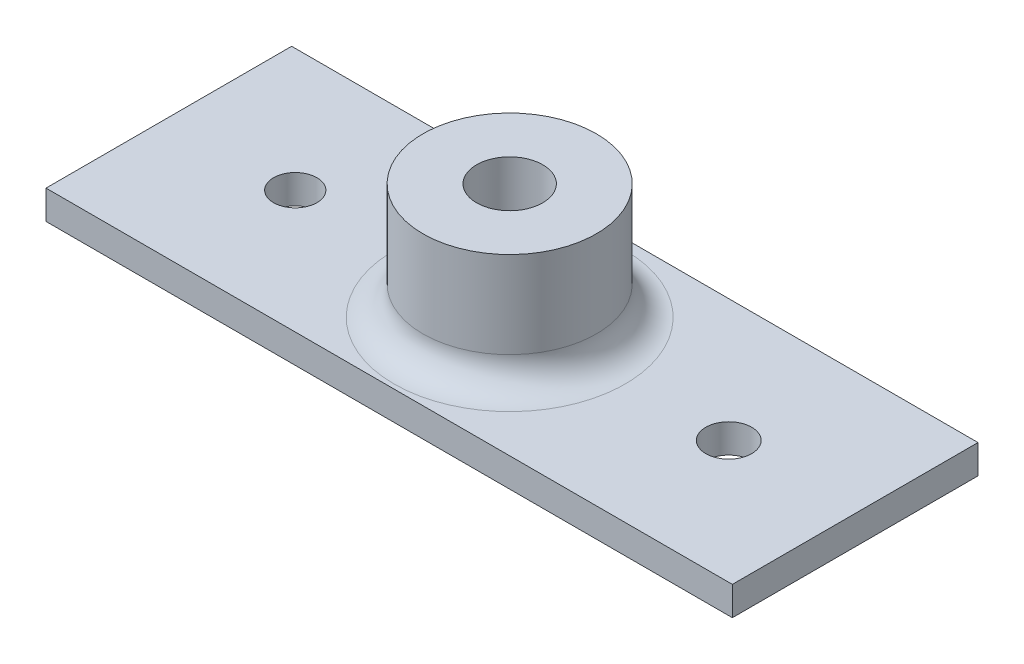
ISO-10303-21;
HEADER;
FILE_DESCRIPTION(('STEP AP214'),'2;1');
FILE_NAME('part.step','',(''),(''),'','','');
FILE_SCHEMA(('AUTOMOTIVE_DESIGN { 1 0 10303 214 1 1 1 1 }'));
ENDSEC;
DATA;
#1=APPLICATION_CONTEXT('core data for automotive mechanical design processes');
#2=APPLICATION_PROTOCOL_DEFINITION('international standard','automotive_design',2000,#1);
#3=PRODUCT_CONTEXT('',#1,'mechanical');
#4=PRODUCT('Part','Part','',(#3));
#5=PRODUCT_RELATED_PRODUCT_CATEGORY('part','',(#4));
#6=PRODUCT_DEFINITION_FORMATION('','',#4);
#7=PRODUCT_DEFINITION_CONTEXT('part definition',#1,'design');
#8=PRODUCT_DEFINITION('design','',#6,#7);
#9=PRODUCT_DEFINITION_SHAPE('','',#8);
#10=(LENGTH_UNIT() NAMED_UNIT(*) SI_UNIT(.MILLI.,.METRE.));
#11=(NAMED_UNIT(*) PLANE_ANGLE_UNIT() SI_UNIT($,.RADIAN.));
#12=(NAMED_UNIT(*) SI_UNIT($,.STERADIAN.) SOLID_ANGLE_UNIT());
#13=UNCERTAINTY_MEASURE_WITH_UNIT(LENGTH_MEASURE(1.E-05),#10,'distance_accuracy_value','');
#14=(GEOMETRIC_REPRESENTATION_CONTEXT(3) GLOBAL_UNCERTAINTY_ASSIGNED_CONTEXT((#13)) GLOBAL_UNIT_ASSIGNED_CONTEXT((#10,
#11,#12)) REPRESENTATION_CONTEXT('',''));
#15=CARTESIAN_POINT('',(0.,0.,0.));
#16=DIRECTION('',(0.,0.,1.));
#17=DIRECTION('',(1.,0.,0.));
#18=AXIS2_PLACEMENT_3D('',#15,#16,#17);
#19=CARTESIAN_POINT('',(10.9719387755102,2.,-15.1352040816326));
#20=DIRECTION('',(-1.,0.,0.));
#21=DIRECTION('',(0.,0.,1.));
#22=AXIS2_PLACEMENT_3D('',#19,#20,#21);
#23=PLANE('',#22);
#24=DIRECTION('',(0.,0.,-1.));
#25=VECTOR('',#24,1.);
#26=CARTESIAN_POINT('',(10.9719387755102,0.,-15.1352040816326));
#27=LINE('',#26,#25);
#28=CARTESIAN_POINT('',(10.9719387755102,0.,1.86479591836735));
#29=VERTEX_POINT('',#28);
#30=CARTESIAN_POINT('',(10.9719387755102,0.,-15.1352040816326));
#31=VERTEX_POINT('',#30);
#32=EDGE_CURVE('E108',#29,#31,#27,.T.);
#33=ORIENTED_EDGE('',*,*,#32,.T.);
#34=DIRECTION('',(0.,-1.,0.));
#35=VECTOR('',#34,1.);
#36=CARTESIAN_POINT('',(10.9719387755102,2.,-15.1352040816326));
#37=LINE('',#36,#35);
#38=CARTESIAN_POINT('',(10.9719387755102,2.,-15.1352040816326));
#39=VERTEX_POINT('',#38);
#40=EDGE_CURVE('E99',#39,#31,#37,.T.);
#41=ORIENTED_EDGE('',*,*,#40,.F.);
#42=DIRECTION('',(0.,0.,-1.));
#43=VECTOR('',#42,1.);
#44=CARTESIAN_POINT('',(10.9719387755102,2.,-15.1352040816326));
#45=LINE('',#44,#43);
#46=CARTESIAN_POINT('',(10.9719387755102,2.,1.86479591836735));
#47=VERTEX_POINT('',#46);
#48=EDGE_CURVE('E90',#47,#39,#45,.T.);
#49=ORIENTED_EDGE('',*,*,#48,.F.);
#50=DIRECTION('',(0.,-1.,0.));
#51=VECTOR('',#50,1.);
#52=CARTESIAN_POINT('',(10.9719387755102,2.,1.86479591836735));
#53=LINE('',#52,#51);
#54=EDGE_CURVE('E104',#47,#29,#53,.T.);
#55=ORIENTED_EDGE('',*,*,#54,.T.);
#56=EDGE_LOOP('',(#33,#41,#49,#55));
#57=FACE_BOUND('',#56,.T.);
#58=ADVANCED_FACE('F35',(#57),#23,.F.);
#59=CARTESIAN_POINT('',(-36.5280612244898,2.,-15.1352040816327));
#60=DIRECTION('',(0.,0.,1.));
#61=DIRECTION('',(1.,0.,0.));
#62=AXIS2_PLACEMENT_3D('',#59,#60,#61);
#63=PLANE('',#62);
#64=DIRECTION('',(-1.,0.,0.));
#65=VECTOR('',#64,1.);
#66=CARTESIAN_POINT('',(-36.5280612244898,0.,-15.1352040816327));
#67=LINE('',#66,#65);
#68=CARTESIAN_POINT('',(-36.5280612244898,0.,-15.1352040816327));
#69=VERTEX_POINT('',#68);
#70=EDGE_CURVE('E96',#31,#69,#67,.T.);
#71=ORIENTED_EDGE('',*,*,#70,.T.);
#72=DIRECTION('',(0.,-1.,0.));
#73=VECTOR('',#72,1.);
#74=CARTESIAN_POINT('',(-36.5280612244898,2.,-15.1352040816327));
#75=LINE('',#74,#73);
#76=CARTESIAN_POINT('',(-36.5280612244898,2.,-15.1352040816327));
#77=VERTEX_POINT('',#76);
#78=EDGE_CURVE('E94',#77,#69,#75,.T.);
#79=ORIENTED_EDGE('',*,*,#78,.F.);
#80=DIRECTION('',(-1.,0.,0.));
#81=VECTOR('',#80,1.);
#82=CARTESIAN_POINT('',(-36.5280612244898,2.,-15.1352040816327));
#83=LINE('',#82,#81);
#84=EDGE_CURVE('E84',#39,#77,#83,.T.);
#85=ORIENTED_EDGE('',*,*,#84,.F.);
#86=ORIENTED_EDGE('',*,*,#40,.T.);
#87=EDGE_LOOP('',(#71,#79,#85,#86));
#88=FACE_BOUND('',#87,.T.);
#89=ADVANCED_FACE('F95',(#88),#63,.F.);
#90=CARTESIAN_POINT('',(-36.5280612244898,2.,-15.1352040816327));
#91=DIRECTION('',(1.,0.,0.));
#92=DIRECTION('',(0.,0.,-1.));
#93=AXIS2_PLACEMENT_3D('',#90,#91,#92);
#94=PLANE('',#93);
#95=DIRECTION('',(0.,0.,1.));
#96=VECTOR('',#95,1.);
#97=CARTESIAN_POINT('',(-36.5280612244898,0.,-15.1352040816327));
#98=LINE('',#97,#96);
#99=CARTESIAN_POINT('',(-36.5280612244898,0.,1.86479591836735));
#100=VERTEX_POINT('',#99);
#101=EDGE_CURVE('E113',#69,#100,#98,.T.);
#102=ORIENTED_EDGE('',*,*,#101,.T.);
#103=DIRECTION('',(0.,-1.,0.));
#104=VECTOR('',#103,1.);
#105=CARTESIAN_POINT('',(-36.5280612244898,2.,1.86479591836735));
#106=LINE('',#105,#104);
#107=CARTESIAN_POINT('',(-36.5280612244898,2.,1.86479591836735));
#108=VERTEX_POINT('',#107);
#109=EDGE_CURVE('E100',#108,#100,#106,.T.);
#110=ORIENTED_EDGE('',*,*,#109,.F.);
#111=DIRECTION('',(0.,0.,1.));
#112=VECTOR('',#111,1.);
#113=CARTESIAN_POINT('',(-36.5280612244898,2.,-15.1352040816327));
#114=LINE('',#113,#112);
#115=EDGE_CURVE('E87',#77,#108,#114,.T.);
#116=ORIENTED_EDGE('',*,*,#115,.F.);
#117=ORIENTED_EDGE('',*,*,#78,.T.);
#118=EDGE_LOOP('',(#102,#110,#116,#117));
#119=FACE_BOUND('',#118,.T.);
#120=ADVANCED_FACE('F102',(#119),#94,.F.);
#121=CARTESIAN_POINT('',(-36.5280612244898,2.,1.86479591836735));
#122=DIRECTION('',(0.,0.,-1.));
#123=DIRECTION('',(-1.,0.,0.));
#124=AXIS2_PLACEMENT_3D('',#121,#122,#123);
#125=PLANE('',#124);
#126=DIRECTION('',(1.,0.,0.));
#127=VECTOR('',#126,1.);
#128=CARTESIAN_POINT('',(-36.5280612244898,0.,1.86479591836735));
#129=LINE('',#128,#127);
#130=EDGE_CURVE('E76',#100,#29,#129,.T.);
#131=ORIENTED_EDGE('',*,*,#130,.T.);
#132=ORIENTED_EDGE('',*,*,#54,.F.);
#133=DIRECTION('',(1.,0.,0.));
#134=VECTOR('',#133,1.);
#135=CARTESIAN_POINT('',(-36.5280612244898,2.,1.86479591836735));
#136=LINE('',#135,#134);
#137=EDGE_CURVE('E56',#108,#47,#136,.T.);
#138=ORIENTED_EDGE('',*,*,#137,.F.);
#139=ORIENTED_EDGE('',*,*,#109,.T.);
#140=EDGE_LOOP('',(#131,#132,#138,#139));
#141=FACE_BOUND('',#140,.T.);
#142=ADVANCED_FACE('F142',(#141),#125,.F.);
#143=CARTESIAN_POINT('',(0.,2.,0.));
#144=DIRECTION('',(0.,1.,0.));
#145=DIRECTION('',(0.,0.,1.));
#146=AXIS2_PLACEMENT_3D('',#143,#144,#145);
#147=PLANE('',#146);
#148=CARTESIAN_POINT('',(-12.7415856036874,2.,-6.43807513250039));
#149=DIRECTION('',(0.,1.,0.));
#150=DIRECTION('',(0.,0.,1.));
#151=AXIS2_PLACEMENT_3D('',#148,#149,#150);
#152=CIRCLE('',#151,8.);
#153=CARTESIAN_POINT('',(-12.7415856036874,2.,1.56192486749961));
#154=VERTEX_POINT('',#153);
#155=EDGE_CURVE('E11',#154,#154,#152,.F.);
#156=ORIENTED_EDGE('',*,*,#155,.T.);
#157=EDGE_LOOP('',(#156));
#158=FACE_BOUND('',#157,.T.);
#159=CARTESIAN_POINT('',(-27.7780612244898,2.,-6.63520408163265));
#160=DIRECTION('',(0.,1.,0.));
#161=DIRECTION('',(0.,0.,1.));
#162=AXIS2_PLACEMENT_3D('',#159,#160,#161);
#163=CIRCLE('',#162,1.5);
#164=CARTESIAN_POINT('',(-27.7780612244898,2.,-5.13520408163265));
#165=VERTEX_POINT('',#164);
#166=EDGE_CURVE('E189',#165,#165,#163,.T.);
#167=ORIENTED_EDGE('',*,*,#166,.F.);
#168=EDGE_LOOP('',(#167));
#169=FACE_BOUND('',#168,.T.);
#170=CARTESIAN_POINT('',(2.2219387755102,2.,-6.63520408163265));
#171=DIRECTION('',(0.,1.,0.));
#172=DIRECTION('',(0.,0.,1.));
#173=AXIS2_PLACEMENT_3D('',#170,#171,#172);
#174=CIRCLE('',#173,1.58631891765594);
#175=CARTESIAN_POINT('',(2.2219387755102,2.,-5.04888516397671));
#176=VERTEX_POINT('',#175);
#177=EDGE_CURVE('E198',#176,#176,#174,.T.);
#178=ORIENTED_EDGE('',*,*,#177,.F.);
#179=EDGE_LOOP('',(#178));
#180=FACE_BOUND('',#179,.T.);
#181=ORIENTED_EDGE('',*,*,#48,.T.);
#182=ORIENTED_EDGE('',*,*,#84,.T.);
#183=ORIENTED_EDGE('',*,*,#115,.T.);
#184=ORIENTED_EDGE('',*,*,#137,.T.);
#185=EDGE_LOOP('',(#181,#182,#183,#184));
#186=FACE_BOUND('',#185,.T.);
#187=ADVANCED_FACE('F85',(#158,#169,#180,#186),#147,.T.);
#188=CARTESIAN_POINT('',(0.,0.,0.));
#189=DIRECTION('',(0.,1.,0.));
#190=DIRECTION('',(0.,0.,1.));
#191=AXIS2_PLACEMENT_3D('',#188,#189,#190);
#192=PLANE('',#191);
#193=CARTESIAN_POINT('',(-27.7780612244898,0.,-6.63520408163265));
#194=DIRECTION('',(0.,1.,0.));
#195=DIRECTION('',(0.,0.,1.));
#196=AXIS2_PLACEMENT_3D('',#193,#194,#195);
#197=CIRCLE('',#196,1.5);
#198=CARTESIAN_POINT('',(-27.7780612244898,0.,-5.13520408163265));
#199=VERTEX_POINT('',#198);
#200=EDGE_CURVE('E111',#199,#199,#197,.T.);
#201=ORIENTED_EDGE('',*,*,#200,.T.);
#202=EDGE_LOOP('',(#201));
#203=FACE_BOUND('',#202,.T.);
#204=CARTESIAN_POINT('',(-12.7780612244898,0.,-6.63520408163265));
#205=DIRECTION('',(0.,1.,0.));
#206=DIRECTION('',(0.,0.,1.));
#207=AXIS2_PLACEMENT_3D('',#204,#205,#206);
#208=CIRCLE('',#207,2.48722887121079);
#209=CARTESIAN_POINT('',(-12.7780612244898,0.,-4.14797521042186));
#210=VERTEX_POINT('',#209);
#211=EDGE_CURVE('E195',#210,#210,#208,.T.);
#212=ORIENTED_EDGE('',*,*,#211,.T.);
#213=EDGE_LOOP('',(#212));
#214=FACE_BOUND('',#213,.T.);
#215=CARTESIAN_POINT('',(2.2219387755102,0.,-6.63520408163265));
#216=DIRECTION('',(0.,1.,0.));
#217=DIRECTION('',(0.,0.,1.));
#218=AXIS2_PLACEMENT_3D('',#215,#216,#217);
#219=CIRCLE('',#218,1.58631891765594);
#220=CARTESIAN_POINT('',(2.2219387755102,0.,-5.04888516397671));
#221=VERTEX_POINT('',#220);
#222=EDGE_CURVE('E183',#221,#221,#219,.T.);
#223=ORIENTED_EDGE('',*,*,#222,.T.);
#224=EDGE_LOOP('',(#223));
#225=FACE_BOUND('',#224,.T.);
#226=ORIENTED_EDGE('',*,*,#32,.F.);
#227=ORIENTED_EDGE('',*,*,#130,.F.);
#228=ORIENTED_EDGE('',*,*,#101,.F.);
#229=ORIENTED_EDGE('',*,*,#70,.F.);
#230=EDGE_LOOP('',(#226,#227,#228,#229));
#231=FACE_BOUND('',#230,.T.);
#232=ADVANCED_FACE('F145',(#203,#214,#225,#231),#192,.F.);
#233=CARTESIAN_POINT('',(2.2219387755102,0.,-6.63520408163265));
#234=DIRECTION('',(0.,1.,0.));
#235=DIRECTION('',(0.,0.,1.));
#236=AXIS2_PLACEMENT_3D('',#233,#234,#235);
#237=CYLINDRICAL_SURFACE('',#236,1.58631891765594);
#238=ORIENTED_EDGE('',*,*,#222,.F.);
#239=EDGE_LOOP('',(#238));
#240=FACE_BOUND('',#239,.T.);
#241=ORIENTED_EDGE('',*,*,#177,.T.);
#242=EDGE_LOOP('',(#241));
#243=FACE_BOUND('',#242,.T.);
#244=ADVANCED_FACE('F148',(#240,#243),#237,.F.);
#245=CARTESIAN_POINT('',(-12.7780612244898,0.,-6.63520408163265));
#246=DIRECTION('',(0.,1.,0.));
#247=DIRECTION('',(0.,0.,1.));
#248=AXIS2_PLACEMENT_3D('',#245,#246,#247);
#249=CYLINDRICAL_SURFACE('',#248,2.48722887121079);
#250=ORIENTED_EDGE('',*,*,#211,.F.);
#251=EDGE_LOOP('',(#250));
#252=FACE_BOUND('',#251,.T.);
#253=CARTESIAN_POINT('',(-12.7780612244898,2.,-6.63520408163265));
#254=DIRECTION('',(0.,1.,0.));
#255=DIRECTION('',(0.,0.,1.));
#256=AXIS2_PLACEMENT_3D('',#253,#254,#255);
#257=CIRCLE('',#256,2.48722887121079);
#258=CARTESIAN_POINT('',(-12.3255203064319,2.,-4.18949065294403));
#259=VERTEX_POINT('',#258);
#260=EDGE_CURVE('E192',#259,#259,#257,.T.);
#261=ORIENTED_EDGE('',*,*,#260,.T.);
#262=EDGE_LOOP('',(#261));
#263=FACE_BOUND('',#262,.T.);
#264=ADVANCED_FACE('F155',(#252,#263),#249,.F.);
#265=CARTESIAN_POINT('',(-27.7780612244898,0.,-6.63520408163265));
#266=DIRECTION('',(0.,1.,0.));
#267=DIRECTION('',(0.,0.,1.));
#268=AXIS2_PLACEMENT_3D('',#265,#266,#267);
#269=CYLINDRICAL_SURFACE('',#268,1.5);
#270=ORIENTED_EDGE('',*,*,#200,.F.);
#271=EDGE_LOOP('',(#270));
#272=FACE_BOUND('',#271,.T.);
#273=ORIENTED_EDGE('',*,*,#166,.T.);
#274=EDGE_LOOP('',(#273));
#275=FACE_BOUND('',#274,.T.);
#276=ADVANCED_FACE('F159',(#272,#275),#269,.F.);
#277=CARTESIAN_POINT('',(-12.7415856036874,2.,-6.43807513250039));
#278=DIRECTION('',(0.,1.,0.));
#279=DIRECTION('',(0.,0.,1.));
#280=AXIS2_PLACEMENT_3D('',#277,#278,#279);
#281=PLANE('',#280);
#282=CARTESIAN_POINT('',(-12.7415856036874,2.,-6.43807513250039));
#283=DIRECTION('',(0.,1.,0.));
#284=DIRECTION('',(0.,0.,1.));
#285=AXIS2_PLACEMENT_3D('',#282,#283,#284);
#286=CIRCLE('',#285,2.28675370192814);
#287=EDGE_CURVE('E48',#259,#259,#286,.T.);
#288=ORIENTED_EDGE('',*,*,#287,.T.);
#289=ORIENTED_EDGE('',*,*,#260,.F.);
#290=EDGE_LOOP('',(#288,#289));
#291=FACE_BOUND('',#290,.T.);
#292=ADVANCED_FACE('F163',(#291),#281,.F.);
#293=CARTESIAN_POINT('',(-12.7415856036874,10.,-6.43807513250039));
#294=DIRECTION('',(0.,1.,0.));
#295=DIRECTION('',(0.,0.,1.));
#296=AXIS2_PLACEMENT_3D('',#293,#294,#295);
#297=PLANE('',#296);
#298=CARTESIAN_POINT('',(-12.7415856036874,10.,-6.43807513250039));
#299=DIRECTION('',(0.,1.,0.));
#300=DIRECTION('',(0.,0.,1.));
#301=AXIS2_PLACEMENT_3D('',#298,#299,#300);
#302=CIRCLE('',#301,6.);
#303=CARTESIAN_POINT('',(-12.7415856036874,10.,-0.438075132500387));
#304=VERTEX_POINT('',#303);
#305=EDGE_CURVE('E178',#304,#304,#302,.T.);
#306=ORIENTED_EDGE('',*,*,#305,.T.);
#307=EDGE_LOOP('',(#306));
#308=FACE_BOUND('',#307,.T.);
#309=CARTESIAN_POINT('',(-12.7415856036874,10.,-6.43807513250039));
#310=DIRECTION('',(0.,1.,0.));
#311=DIRECTION('',(0.,0.,1.));
#312=AXIS2_PLACEMENT_3D('',#309,#310,#311);
#313=CIRCLE('',#312,2.28675370192814);
#314=CARTESIAN_POINT('',(-12.7415856036874,10.,-4.15132143057225));
#315=VERTEX_POINT('',#314);
#316=EDGE_CURVE('E181',#315,#315,#313,.T.);
#317=ORIENTED_EDGE('',*,*,#316,.F.);
#318=EDGE_LOOP('',(#317));
#319=FACE_BOUND('',#318,.T.);
#320=ADVANCED_FACE('F167',(#308,#319),#297,.T.);
#321=CARTESIAN_POINT('',(-12.7415856036874,10.,-6.43807513250039));
#322=DIRECTION('',(0.,-1.,0.));
#323=DIRECTION('',(0.,0.,-1.));
#324=AXIS2_PLACEMENT_3D('',#321,#322,#323);
#325=CYLINDRICAL_SURFACE('',#324,6.);
#326=CARTESIAN_POINT('',(-12.7415856036874,4.,-6.43807513250039));
#327=DIRECTION('',(0.,1.,0.));
#328=DIRECTION('',(0.,0.,1.));
#329=AXIS2_PLACEMENT_3D('',#326,#327,#328);
#330=CIRCLE('',#329,6.);
#331=CARTESIAN_POINT('',(-12.7415856036874,4.,-0.438075132500387));
#332=VERTEX_POINT('',#331);
#333=EDGE_CURVE('E43',#332,#332,#330,.T.);
#334=ORIENTED_EDGE('',*,*,#333,.T.);
#335=EDGE_LOOP('',(#334));
#336=FACE_BOUND('',#335,.T.);
#337=ORIENTED_EDGE('',*,*,#305,.F.);
#338=EDGE_LOOP('',(#337));
#339=FACE_BOUND('',#338,.T.);
#340=ADVANCED_FACE('F121',(#336,#339),#325,.T.);
#341=CARTESIAN_POINT('',(-12.7415856036874,10.,-6.43807513250039));
#342=DIRECTION('',(0.,-1.,0.));
#343=DIRECTION('',(0.,0.,-1.));
#344=AXIS2_PLACEMENT_3D('',#341,#342,#343);
#345=CYLINDRICAL_SURFACE('',#344,2.28675370192814);
#346=ORIENTED_EDGE('',*,*,#316,.T.);
#347=EDGE_LOOP('',(#346));
#348=FACE_BOUND('',#347,.T.);
#349=ORIENTED_EDGE('',*,*,#287,.F.);
#350=EDGE_LOOP('',(#349));
#351=FACE_BOUND('',#350,.T.);
#352=ADVANCED_FACE('F125',(#348,#351),#345,.F.);
#353=CARTESIAN_POINT('',(-12.7415856036874,4.,-6.43807513250039));
#354=DIRECTION('',(0.,1.,0.));
#355=DIRECTION('',(0.,0.,1.));
#356=AXIS2_PLACEMENT_3D('',#353,#354,#355);
#357=TOROIDAL_SURFACE('',#356,8.,2.);
#358=ORIENTED_EDGE('',*,*,#155,.F.);
#359=EDGE_LOOP('',(#358));
#360=FACE_BOUND('',#359,.T.);
#361=ORIENTED_EDGE('',*,*,#333,.F.);
#362=EDGE_LOOP('',(#361));
#363=FACE_BOUND('',#362,.T.);
#364=ADVANCED_FACE('F37',(#360,#363),#357,.F.);
#365=CLOSED_SHELL('',(#58,#89,#120,#142,#187,#232,#244,#264,#276,#292,#320,#340,#352,#364));
#366=MANIFOLD_SOLID_BREP('B2',#365);
#367=ADVANCED_BREP_SHAPE_REPRESENTATION('',(#18,#366),#14);
#368=SHAPE_DEFINITION_REPRESENTATION(#9,#367);
ENDSEC;
END-ISO-10303-21;
